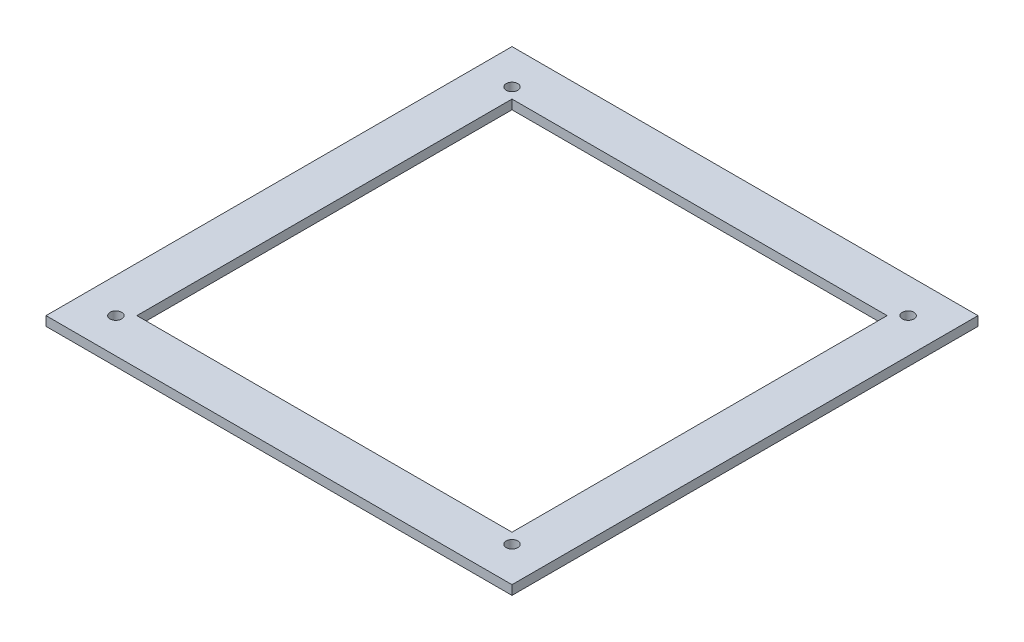
ISO-10303-21;
HEADER;
FILE_DESCRIPTION(('STEP AP214'),'2;1');
FILE_NAME('part.step','',(''),(''),'','','');
FILE_SCHEMA(('AUTOMOTIVE_DESIGN { 1 0 10303 214 1 1 1 1 }'));
ENDSEC;
DATA;
#1=APPLICATION_CONTEXT('core data for automotive mechanical design processes');
#2=APPLICATION_PROTOCOL_DEFINITION('international standard','automotive_design',2000,#1);
#3=PRODUCT_CONTEXT('',#1,'mechanical');
#4=PRODUCT('Part','Part','',(#3));
#5=PRODUCT_RELATED_PRODUCT_CATEGORY('part','',(#4));
#6=PRODUCT_DEFINITION_FORMATION('','',#4);
#7=PRODUCT_DEFINITION_CONTEXT('part definition',#1,'design');
#8=PRODUCT_DEFINITION('design','',#6,#7);
#9=PRODUCT_DEFINITION_SHAPE('','',#8);
#10=(LENGTH_UNIT() NAMED_UNIT(*) SI_UNIT(.MILLI.,.METRE.));
#11=(NAMED_UNIT(*) PLANE_ANGLE_UNIT() SI_UNIT($,.RADIAN.));
#12=(NAMED_UNIT(*) SI_UNIT($,.STERADIAN.) SOLID_ANGLE_UNIT());
#13=UNCERTAINTY_MEASURE_WITH_UNIT(LENGTH_MEASURE(1.E-05),#10,'distance_accuracy_value','');
#14=(GEOMETRIC_REPRESENTATION_CONTEXT(3) GLOBAL_UNCERTAINTY_ASSIGNED_CONTEXT((#13)) GLOBAL_UNIT_ASSIGNED_CONTEXT((#10,
#11,#12)) REPRESENTATION_CONTEXT('',''));
#15=CARTESIAN_POINT('',(0.,0.,0.));
#16=DIRECTION('',(0.,0.,1.));
#17=DIRECTION('',(1.,0.,0.));
#18=AXIS2_PLACEMENT_3D('',#15,#16,#17);
#19=CARTESIAN_POINT('',(0.,4.,0.));
#20=DIRECTION('',(0.,-1.,0.));
#21=DIRECTION('',(0.,0.,-1.));
#22=AXIS2_PLACEMENT_3D('',#19,#20,#21);
#23=PLANE('',#22);
#24=DIRECTION('',(0.,0.,1.));
#25=VECTOR('',#24,1.);
#26=CARTESIAN_POINT('',(19.5,4.,-180.5));
#27=LINE('',#26,#25);
#28=CARTESIAN_POINT('',(19.5,4.,-180.5));
#29=VERTEX_POINT('',#28);
#30=CARTESIAN_POINT('',(19.5,4.,-19.5));
#31=VERTEX_POINT('',#30);
#32=EDGE_CURVE('E115',#29,#31,#27,.T.);
#33=ORIENTED_EDGE('',*,*,#32,.F.);
#34=DIRECTION('',(-1.,0.,0.));
#35=VECTOR('',#34,1.);
#36=CARTESIAN_POINT('',(180.5,4.,-180.5));
#37=LINE('',#36,#35);
#38=CARTESIAN_POINT('',(180.5,4.,-180.5));
#39=VERTEX_POINT('',#38);
#40=EDGE_CURVE('E54',#39,#29,#37,.T.);
#41=ORIENTED_EDGE('',*,*,#40,.F.);
#42=DIRECTION('',(0.,0.,-1.));
#43=VECTOR('',#42,1.);
#44=CARTESIAN_POINT('',(180.5,4.,-19.5));
#45=LINE('',#44,#43);
#46=CARTESIAN_POINT('',(180.5,4.,-19.5));
#47=VERTEX_POINT('',#46);
#48=EDGE_CURVE('E122',#47,#39,#45,.T.);
#49=ORIENTED_EDGE('',*,*,#48,.F.);
#50=DIRECTION('',(1.,0.,0.));
#51=VECTOR('',#50,1.);
#52=CARTESIAN_POINT('',(19.5,4.,-19.5));
#53=LINE('',#52,#51);
#54=EDGE_CURVE('E106',#31,#47,#53,.T.);
#55=ORIENTED_EDGE('',*,*,#54,.F.);
#56=EDGE_LOOP('',(#33,#41,#49,#55));
#57=FACE_BOUND('',#56,.T.);
#58=DIRECTION('',(0.,0.,1.));
#59=VECTOR('',#58,1.);
#60=CARTESIAN_POINT('',(0.,4.,0.));
#61=LINE('',#60,#59);
#62=CARTESIAN_POINT('',(0.,4.,-200.));
#63=VERTEX_POINT('',#62);
#64=CARTESIAN_POINT('',(0.,4.,0.));
#65=VERTEX_POINT('',#64);
#66=EDGE_CURVE('E141',#63,#65,#61,.T.);
#67=ORIENTED_EDGE('',*,*,#66,.T.);
#68=DIRECTION('',(1.,0.,0.));
#69=VECTOR('',#68,1.);
#70=CARTESIAN_POINT('',(0.,4.,0.));
#71=LINE('',#70,#69);
#72=CARTESIAN_POINT('',(200.,4.,0.));
#73=VERTEX_POINT('',#72);
#74=EDGE_CURVE('E145',#65,#73,#71,.T.);
#75=ORIENTED_EDGE('',*,*,#74,.T.);
#76=DIRECTION('',(0.,0.,-1.));
#77=VECTOR('',#76,1.);
#78=CARTESIAN_POINT('',(200.,4.,0.));
#79=LINE('',#78,#77);
#80=CARTESIAN_POINT('',(200.,4.,-200.));
#81=VERTEX_POINT('',#80);
#82=EDGE_CURVE('E152',#73,#81,#79,.T.);
#83=ORIENTED_EDGE('',*,*,#82,.T.);
#84=DIRECTION('',(-1.,0.,0.));
#85=VECTOR('',#84,1.);
#86=CARTESIAN_POINT('',(0.,4.,-200.));
#87=LINE('',#86,#85);
#88=EDGE_CURVE('E156',#81,#63,#87,.T.);
#89=ORIENTED_EDGE('',*,*,#88,.T.);
#90=EDGE_LOOP('',(#67,#75,#83,#89));
#91=FACE_BOUND('',#90,.T.);
#92=CARTESIAN_POINT('',(15.,4.,-185.));
#93=DIRECTION('',(0.,1.,0.));
#94=DIRECTION('',(0.,0.,1.));
#95=AXIS2_PLACEMENT_3D('',#92,#93,#94);
#96=CIRCLE('',#95,2.5);
#97=CARTESIAN_POINT('',(15.,4.,-182.5));
#98=VERTEX_POINT('',#97);
#99=EDGE_CURVE('E163',#98,#98,#96,.T.);
#100=ORIENTED_EDGE('',*,*,#99,.F.);
#101=EDGE_LOOP('',(#100));
#102=FACE_BOUND('',#101,.T.);
#103=CARTESIAN_POINT('',(185.,4.,-185.));
#104=DIRECTION('',(0.,1.,0.));
#105=DIRECTION('',(0.,0.,1.));
#106=AXIS2_PLACEMENT_3D('',#103,#104,#105);
#107=CIRCLE('',#106,2.5);
#108=CARTESIAN_POINT('',(185.,4.,-182.5));
#109=VERTEX_POINT('',#108);
#110=EDGE_CURVE('E171',#109,#109,#107,.T.);
#111=ORIENTED_EDGE('',*,*,#110,.F.);
#112=EDGE_LOOP('',(#111));
#113=FACE_BOUND('',#112,.T.);
#114=CARTESIAN_POINT('',(185.,4.,-15.0000000000001));
#115=DIRECTION('',(0.,1.,0.));
#116=DIRECTION('',(0.,0.,1.));
#117=AXIS2_PLACEMENT_3D('',#114,#115,#116);
#118=CIRCLE('',#117,2.5);
#119=CARTESIAN_POINT('',(185.,4.,-12.5000000000001));
#120=VERTEX_POINT('',#119);
#121=EDGE_CURVE('E172',#120,#120,#118,.T.);
#122=ORIENTED_EDGE('',*,*,#121,.F.);
#123=EDGE_LOOP('',(#122));
#124=FACE_BOUND('',#123,.T.);
#125=CARTESIAN_POINT('',(15.,4.,-15.));
#126=DIRECTION('',(0.,1.,0.));
#127=DIRECTION('',(0.,0.,1.));
#128=AXIS2_PLACEMENT_3D('',#125,#126,#127);
#129=CIRCLE('',#128,2.5);
#130=CARTESIAN_POINT('',(15.,4.,-12.5));
#131=VERTEX_POINT('',#130);
#132=EDGE_CURVE('E180',#131,#131,#129,.T.);
#133=ORIENTED_EDGE('',*,*,#132,.F.);
#134=EDGE_LOOP('',(#133));
#135=FACE_BOUND('',#134,.T.);
#136=ADVANCED_FACE('F39',(#57,#91,#102,#113,#124,#135),#23,.F.);
#137=CARTESIAN_POINT('',(0.,0.,0.));
#138=DIRECTION('',(0.,-1.,0.));
#139=DIRECTION('',(0.,0.,-1.));
#140=AXIS2_PLACEMENT_3D('',#137,#138,#139);
#141=PLANE('',#140);
#142=DIRECTION('',(1.,0.,0.));
#143=VECTOR('',#142,1.);
#144=CARTESIAN_POINT('',(0.,0.,-180.5));
#145=LINE('',#144,#143);
#146=CARTESIAN_POINT('',(19.5,0.,-180.5));
#147=VERTEX_POINT('',#146);
#148=CARTESIAN_POINT('',(180.5,0.,-180.5));
#149=VERTEX_POINT('',#148);
#150=EDGE_CURVE('E12',#147,#149,#145,.T.);
#151=ORIENTED_EDGE('',*,*,#150,.F.);
#152=DIRECTION('',(0.,0.,-1.));
#153=VECTOR('',#152,1.);
#154=CARTESIAN_POINT('',(19.5,0.,0.));
#155=LINE('',#154,#153);
#156=CARTESIAN_POINT('',(19.5,0.,-19.5));
#157=VERTEX_POINT('',#156);
#158=EDGE_CURVE('E205',#157,#147,#155,.T.);
#159=ORIENTED_EDGE('',*,*,#158,.F.);
#160=DIRECTION('',(-1.,0.,0.));
#161=VECTOR('',#160,1.);
#162=CARTESIAN_POINT('',(0.,0.,-19.5));
#163=LINE('',#162,#161);
#164=CARTESIAN_POINT('',(180.5,0.,-19.5));
#165=VERTEX_POINT('',#164);
#166=EDGE_CURVE('E109',#165,#157,#163,.T.);
#167=ORIENTED_EDGE('',*,*,#166,.F.);
#168=DIRECTION('',(0.,0.,1.));
#169=VECTOR('',#168,1.);
#170=CARTESIAN_POINT('',(180.5,0.,0.));
#171=LINE('',#170,#169);
#172=EDGE_CURVE('E47',#149,#165,#171,.T.);
#173=ORIENTED_EDGE('',*,*,#172,.F.);
#174=EDGE_LOOP('',(#151,#159,#167,#173));
#175=FACE_BOUND('',#174,.T.);
#176=CARTESIAN_POINT('',(185.,0.,-15.0000000000001));
#177=DIRECTION('',(0.,1.,0.));
#178=DIRECTION('',(0.,0.,1.));
#179=AXIS2_PLACEMENT_3D('',#176,#177,#178);
#180=CIRCLE('',#179,2.5);
#181=CARTESIAN_POINT('',(185.,0.,-12.5000000000001));
#182=VERTEX_POINT('',#181);
#183=EDGE_CURVE('E177',#182,#182,#180,.T.);
#184=ORIENTED_EDGE('',*,*,#183,.T.);
#185=EDGE_LOOP('',(#184));
#186=FACE_BOUND('',#185,.T.);
#187=CARTESIAN_POINT('',(15.,0.,-185.));
#188=DIRECTION('',(0.,1.,0.));
#189=DIRECTION('',(0.,0.,1.));
#190=AXIS2_PLACEMENT_3D('',#187,#188,#189);
#191=CIRCLE('',#190,2.5);
#192=CARTESIAN_POINT('',(15.,0.,-182.5));
#193=VERTEX_POINT('',#192);
#194=EDGE_CURVE('E147',#193,#193,#191,.T.);
#195=ORIENTED_EDGE('',*,*,#194,.T.);
#196=EDGE_LOOP('',(#195));
#197=FACE_BOUND('',#196,.T.);
#198=DIRECTION('',(0.,0.,1.));
#199=VECTOR('',#198,1.);
#200=CARTESIAN_POINT('',(0.,0.,0.));
#201=LINE('',#200,#199);
#202=CARTESIAN_POINT('',(0.,0.,-200.));
#203=VERTEX_POINT('',#202);
#204=CARTESIAN_POINT('',(0.,0.,0.));
#205=VERTEX_POINT('',#204);
#206=EDGE_CURVE('E168',#203,#205,#201,.T.);
#207=ORIENTED_EDGE('',*,*,#206,.F.);
#208=DIRECTION('',(-1.,0.,0.));
#209=VECTOR('',#208,1.);
#210=CARTESIAN_POINT('',(0.,0.,-200.));
#211=LINE('',#210,#209);
#212=CARTESIAN_POINT('',(200.,0.,-200.));
#213=VERTEX_POINT('',#212);
#214=EDGE_CURVE('E146',#213,#203,#211,.T.);
#215=ORIENTED_EDGE('',*,*,#214,.F.);
#216=DIRECTION('',(0.,0.,-1.));
#217=VECTOR('',#216,1.);
#218=CARTESIAN_POINT('',(200.,0.,0.));
#219=LINE('',#218,#217);
#220=CARTESIAN_POINT('',(200.,0.,0.));
#221=VERTEX_POINT('',#220);
#222=EDGE_CURVE('E222',#221,#213,#219,.T.);
#223=ORIENTED_EDGE('',*,*,#222,.F.);
#224=DIRECTION('',(1.,0.,0.));
#225=VECTOR('',#224,1.);
#226=CARTESIAN_POINT('',(0.,0.,0.));
#227=LINE('',#226,#225);
#228=EDGE_CURVE('E224',#205,#221,#227,.T.);
#229=ORIENTED_EDGE('',*,*,#228,.F.);
#230=EDGE_LOOP('',(#207,#215,#223,#229));
#231=FACE_BOUND('',#230,.T.);
#232=CARTESIAN_POINT('',(185.,0.,-185.));
#233=DIRECTION('',(0.,1.,0.));
#234=DIRECTION('',(0.,0.,1.));
#235=AXIS2_PLACEMENT_3D('',#232,#233,#234);
#236=CIRCLE('',#235,2.5);
#237=CARTESIAN_POINT('',(185.,0.,-182.5));
#238=VERTEX_POINT('',#237);
#239=EDGE_CURVE('E169',#238,#238,#236,.T.);
#240=ORIENTED_EDGE('',*,*,#239,.T.);
#241=EDGE_LOOP('',(#240));
#242=FACE_BOUND('',#241,.T.);
#243=CARTESIAN_POINT('',(15.,0.,-15.));
#244=DIRECTION('',(0.,1.,0.));
#245=DIRECTION('',(0.,0.,1.));
#246=AXIS2_PLACEMENT_3D('',#243,#244,#245);
#247=CIRCLE('',#246,2.5);
#248=CARTESIAN_POINT('',(15.,0.,-12.5));
#249=VERTEX_POINT('',#248);
#250=EDGE_CURVE('E185',#249,#249,#247,.T.);
#251=ORIENTED_EDGE('',*,*,#250,.T.);
#252=EDGE_LOOP('',(#251));
#253=FACE_BOUND('',#252,.T.);
#254=ADVANCED_FACE('F203',(#175,#186,#197,#231,#242,#253),#141,.T.);
#255=CARTESIAN_POINT('',(0.,4.,0.));
#256=DIRECTION('',(1.,0.,0.));
#257=DIRECTION('',(0.,0.,-1.));
#258=AXIS2_PLACEMENT_3D('',#255,#256,#257);
#259=PLANE('',#258);
#260=ORIENTED_EDGE('',*,*,#206,.T.);
#261=DIRECTION('',(0.,-1.,0.));
#262=VECTOR('',#261,1.);
#263=CARTESIAN_POINT('',(0.,4.,0.));
#264=LINE('',#263,#262);
#265=EDGE_CURVE('E207',#65,#205,#264,.T.);
#266=ORIENTED_EDGE('',*,*,#265,.F.);
#267=ORIENTED_EDGE('',*,*,#66,.F.);
#268=DIRECTION('',(0.,-1.,0.));
#269=VECTOR('',#268,1.);
#270=CARTESIAN_POINT('',(0.,4.,-200.));
#271=LINE('',#270,#269);
#272=EDGE_CURVE('E218',#63,#203,#271,.T.);
#273=ORIENTED_EDGE('',*,*,#272,.T.);
#274=EDGE_LOOP('',(#260,#266,#267,#273));
#275=FACE_BOUND('',#274,.T.);
#276=ADVANCED_FACE('F41',(#275),#259,.F.);
#277=CARTESIAN_POINT('',(0.,4.,0.));
#278=DIRECTION('',(0.,0.,-1.));
#279=DIRECTION('',(-1.,0.,0.));
#280=AXIS2_PLACEMENT_3D('',#277,#278,#279);
#281=PLANE('',#280);
#282=ORIENTED_EDGE('',*,*,#228,.T.);
#283=DIRECTION('',(0.,-1.,0.));
#284=VECTOR('',#283,1.);
#285=CARTESIAN_POINT('',(200.,4.,0.));
#286=LINE('',#285,#284);
#287=EDGE_CURVE('E212',#73,#221,#286,.T.);
#288=ORIENTED_EDGE('',*,*,#287,.F.);
#289=ORIENTED_EDGE('',*,*,#74,.F.);
#290=ORIENTED_EDGE('',*,*,#265,.T.);
#291=EDGE_LOOP('',(#282,#288,#289,#290));
#292=FACE_BOUND('',#291,.T.);
#293=ADVANCED_FACE('F237',(#292),#281,.F.);
#294=CARTESIAN_POINT('',(200.,4.,0.));
#295=DIRECTION('',(-1.,0.,0.));
#296=DIRECTION('',(0.,0.,1.));
#297=AXIS2_PLACEMENT_3D('',#294,#295,#296);
#298=PLANE('',#297);
#299=ORIENTED_EDGE('',*,*,#222,.T.);
#300=DIRECTION('',(0.,-1.,0.));
#301=VECTOR('',#300,1.);
#302=CARTESIAN_POINT('',(200.,4.,-200.));
#303=LINE('',#302,#301);
#304=EDGE_CURVE('E215',#81,#213,#303,.T.);
#305=ORIENTED_EDGE('',*,*,#304,.F.);
#306=ORIENTED_EDGE('',*,*,#82,.F.);
#307=ORIENTED_EDGE('',*,*,#287,.T.);
#308=EDGE_LOOP('',(#299,#305,#306,#307));
#309=FACE_BOUND('',#308,.T.);
#310=ADVANCED_FACE('F246',(#309),#298,.F.);
#311=CARTESIAN_POINT('',(0.,4.,-200.));
#312=DIRECTION('',(0.,0.,1.));
#313=DIRECTION('',(1.,0.,0.));
#314=AXIS2_PLACEMENT_3D('',#311,#312,#313);
#315=PLANE('',#314);
#316=ORIENTED_EDGE('',*,*,#214,.T.);
#317=ORIENTED_EDGE('',*,*,#272,.F.);
#318=ORIENTED_EDGE('',*,*,#88,.F.);
#319=ORIENTED_EDGE('',*,*,#304,.T.);
#320=EDGE_LOOP('',(#316,#317,#318,#319));
#321=FACE_BOUND('',#320,.T.);
#322=ADVANCED_FACE('F244',(#321),#315,.F.);
#323=CARTESIAN_POINT('',(15.,4.,-185.));
#324=DIRECTION('',(0.,-1.,0.));
#325=DIRECTION('',(0.,0.,-1.));
#326=AXIS2_PLACEMENT_3D('',#323,#324,#325);
#327=CYLINDRICAL_SURFACE('',#326,2.5);
#328=ORIENTED_EDGE('',*,*,#99,.T.);
#329=EDGE_LOOP('',(#328));
#330=FACE_BOUND('',#329,.T.);
#331=ORIENTED_EDGE('',*,*,#194,.F.);
#332=EDGE_LOOP('',(#331));
#333=FACE_BOUND('',#332,.T.);
#334=ADVANCED_FACE('F253',(#330,#333),#327,.F.);
#335=CARTESIAN_POINT('',(185.,4.,-185.));
#336=DIRECTION('',(0.,-1.,0.));
#337=DIRECTION('',(0.,0.,-1.));
#338=AXIS2_PLACEMENT_3D('',#335,#336,#337);
#339=CYLINDRICAL_SURFACE('',#338,2.5);
#340=ORIENTED_EDGE('',*,*,#110,.T.);
#341=EDGE_LOOP('',(#340));
#342=FACE_BOUND('',#341,.T.);
#343=ORIENTED_EDGE('',*,*,#239,.F.);
#344=EDGE_LOOP('',(#343));
#345=FACE_BOUND('',#344,.T.);
#346=ADVANCED_FACE('F265',(#342,#345),#339,.F.);
#347=CARTESIAN_POINT('',(185.,4.,-15.0000000000001));
#348=DIRECTION('',(0.,-1.,0.));
#349=DIRECTION('',(0.,0.,-1.));
#350=AXIS2_PLACEMENT_3D('',#347,#348,#349);
#351=CYLINDRICAL_SURFACE('',#350,2.5);
#352=ORIENTED_EDGE('',*,*,#121,.T.);
#353=EDGE_LOOP('',(#352));
#354=FACE_BOUND('',#353,.T.);
#355=ORIENTED_EDGE('',*,*,#183,.F.);
#356=EDGE_LOOP('',(#355));
#357=FACE_BOUND('',#356,.T.);
#358=ADVANCED_FACE('F269',(#354,#357),#351,.F.);
#359=CARTESIAN_POINT('',(15.,4.,-15.));
#360=DIRECTION('',(0.,-1.,0.));
#361=DIRECTION('',(0.,0.,-1.));
#362=AXIS2_PLACEMENT_3D('',#359,#360,#361);
#363=CYLINDRICAL_SURFACE('',#362,2.5);
#364=ORIENTED_EDGE('',*,*,#132,.T.);
#365=EDGE_LOOP('',(#364));
#366=FACE_BOUND('',#365,.T.);
#367=ORIENTED_EDGE('',*,*,#250,.F.);
#368=EDGE_LOOP('',(#367));
#369=FACE_BOUND('',#368,.T.);
#370=ADVANCED_FACE('F273',(#366,#369),#363,.F.);
#371=CARTESIAN_POINT('',(180.5,-6.,-180.5));
#372=DIRECTION('',(0.,0.,-1.));
#373=DIRECTION('',(-1.,0.,0.));
#374=AXIS2_PLACEMENT_3D('',#371,#372,#373);
#375=PLANE('',#374);
#376=ORIENTED_EDGE('',*,*,#150,.T.);
#377=DIRECTION('',(0.,1.,0.));
#378=VECTOR('',#377,1.);
#379=CARTESIAN_POINT('',(180.5,-6.,-180.5));
#380=LINE('',#379,#378);
#381=EDGE_CURVE('E187',#149,#39,#380,.T.);
#382=ORIENTED_EDGE('',*,*,#381,.T.);
#383=ORIENTED_EDGE('',*,*,#40,.T.);
#384=DIRECTION('',(0.,1.,0.));
#385=VECTOR('',#384,1.);
#386=CARTESIAN_POINT('',(19.5,-6.,-180.5));
#387=LINE('',#386,#385);
#388=EDGE_CURVE('E112',#147,#29,#387,.T.);
#389=ORIENTED_EDGE('',*,*,#388,.F.);
#390=EDGE_LOOP('',(#376,#382,#383,#389));
#391=FACE_BOUND('',#390,.T.);
#392=ADVANCED_FACE('F194',(#391),#375,.F.);
#393=CARTESIAN_POINT('',(180.5,-6.,-19.5));
#394=DIRECTION('',(1.,0.,0.));
#395=DIRECTION('',(0.,0.,-1.));
#396=AXIS2_PLACEMENT_3D('',#393,#394,#395);
#397=PLANE('',#396);
#398=ORIENTED_EDGE('',*,*,#172,.T.);
#399=DIRECTION('',(0.,1.,0.));
#400=VECTOR('',#399,1.);
#401=CARTESIAN_POINT('',(180.5,-6.,-19.5));
#402=LINE('',#401,#400);
#403=EDGE_CURVE('E111',#165,#47,#402,.T.);
#404=ORIENTED_EDGE('',*,*,#403,.T.);
#405=ORIENTED_EDGE('',*,*,#48,.T.);
#406=ORIENTED_EDGE('',*,*,#381,.F.);
#407=EDGE_LOOP('',(#398,#404,#405,#406));
#408=FACE_BOUND('',#407,.T.);
#409=ADVANCED_FACE('F198',(#408),#397,.F.);
#410=CARTESIAN_POINT('',(19.5,-6.,-19.5));
#411=DIRECTION('',(0.,0.,1.));
#412=DIRECTION('',(1.,0.,0.));
#413=AXIS2_PLACEMENT_3D('',#410,#411,#412);
#414=PLANE('',#413);
#415=ORIENTED_EDGE('',*,*,#166,.T.);
#416=DIRECTION('',(0.,1.,0.));
#417=VECTOR('',#416,1.);
#418=CARTESIAN_POINT('',(19.5,-6.,-19.5));
#419=LINE('',#418,#417);
#420=EDGE_CURVE('E62',#157,#31,#419,.T.);
#421=ORIENTED_EDGE('',*,*,#420,.T.);
#422=ORIENTED_EDGE('',*,*,#54,.T.);
#423=ORIENTED_EDGE('',*,*,#403,.F.);
#424=EDGE_LOOP('',(#415,#421,#422,#423));
#425=FACE_BOUND('',#424,.T.);
#426=ADVANCED_FACE('F103',(#425),#414,.F.);
#427=CARTESIAN_POINT('',(19.5,-6.,-180.5));
#428=DIRECTION('',(-1.,0.,0.));
#429=DIRECTION('',(0.,0.,1.));
#430=AXIS2_PLACEMENT_3D('',#427,#428,#429);
#431=PLANE('',#430);
#432=ORIENTED_EDGE('',*,*,#158,.T.);
#433=ORIENTED_EDGE('',*,*,#388,.T.);
#434=ORIENTED_EDGE('',*,*,#32,.T.);
#435=ORIENTED_EDGE('',*,*,#420,.F.);
#436=EDGE_LOOP('',(#432,#433,#434,#435));
#437=FACE_BOUND('',#436,.T.);
#438=ADVANCED_FACE('F116',(#437),#431,.F.);
#439=CLOSED_SHELL('',(#136,#254,#276,#293,#310,#322,#334,#346,#358,#370,#392,#409,#426,#438));
#440=MANIFOLD_SOLID_BREP('B2',#439);
#441=ADVANCED_BREP_SHAPE_REPRESENTATION('',(#18,#440),#14);
#442=SHAPE_DEFINITION_REPRESENTATION(#9,#441);
ENDSEC;
END-ISO-10303-21;
